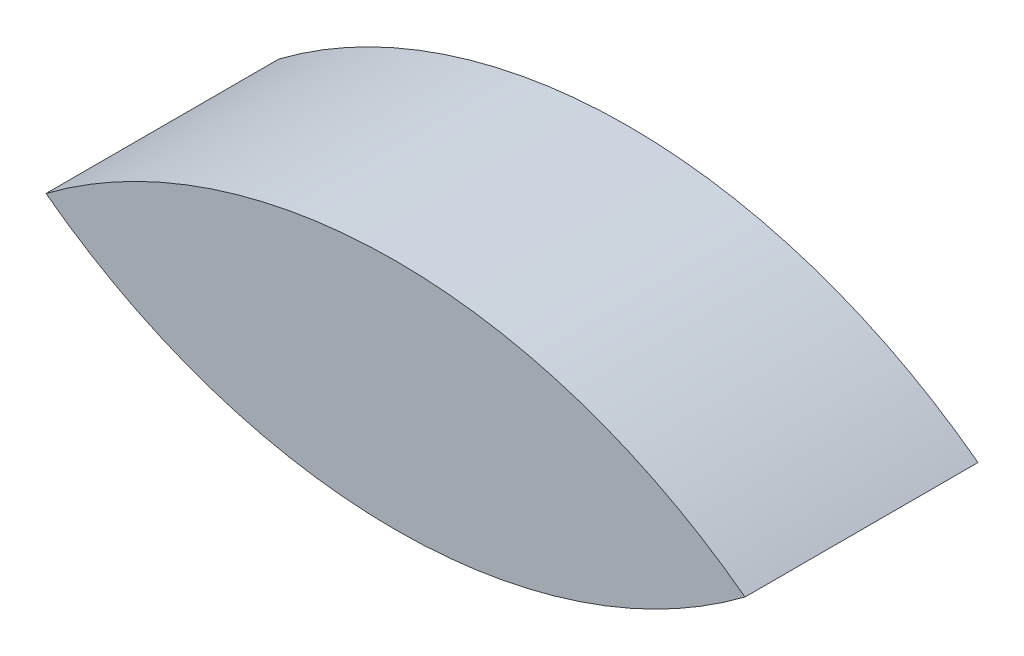
ISO-10303-21;
HEADER;
FILE_DESCRIPTION(('STEP AP214'),'2;1');
FILE_NAME('part.step','',(''),(''),'','','');
FILE_SCHEMA(('AUTOMOTIVE_DESIGN { 1 0 10303 214 1 1 1 1 }'));
ENDSEC;
DATA;
#1=APPLICATION_CONTEXT('core data for automotive mechanical design processes');
#2=APPLICATION_PROTOCOL_DEFINITION('international standard','automotive_design',2000,#1);
#3=PRODUCT_CONTEXT('',#1,'mechanical');
#4=PRODUCT('Part','Part','',(#3));
#5=PRODUCT_RELATED_PRODUCT_CATEGORY('part','',(#4));
#6=PRODUCT_DEFINITION_FORMATION('','',#4);
#7=PRODUCT_DEFINITION_CONTEXT('part definition',#1,'design');
#8=PRODUCT_DEFINITION('design','',#6,#7);
#9=PRODUCT_DEFINITION_SHAPE('','',#8);
#10=(LENGTH_UNIT() NAMED_UNIT(*) SI_UNIT(.MILLI.,.METRE.));
#11=(NAMED_UNIT(*) PLANE_ANGLE_UNIT() SI_UNIT($,.RADIAN.));
#12=(NAMED_UNIT(*) SI_UNIT($,.STERADIAN.) SOLID_ANGLE_UNIT());
#13=UNCERTAINTY_MEASURE_WITH_UNIT(LENGTH_MEASURE(1.E-05),#10,'distance_accuracy_value','');
#14=(GEOMETRIC_REPRESENTATION_CONTEXT(3) GLOBAL_UNCERTAINTY_ASSIGNED_CONTEXT((#13)) GLOBAL_UNIT_ASSIGNED_CONTEXT((#10,
#11,#12)) REPRESENTATION_CONTEXT('',''));
#15=CARTESIAN_POINT('',(0.,0.,0.));
#16=DIRECTION('',(0.,0.,1.));
#17=DIRECTION('',(1.,0.,0.));
#18=AXIS2_PLACEMENT_3D('',#15,#16,#17);
#19=CARTESIAN_POINT('',(0.,20.,5.));
#20=DIRECTION('',(0.,0.,-1.));
#21=DIRECTION('',(-1.,0.,0.));
#22=AXIS2_PLACEMENT_3D('',#19,#20,#21);
#23=CYLINDRICAL_SURFACE('',#22,25.);
#24=CARTESIAN_POINT('',(0.,20.,-5.));
#25=DIRECTION('',(0.,0.,1.));
#26=DIRECTION('',(1.,0.,0.));
#27=AXIS2_PLACEMENT_3D('',#24,#25,#26);
#28=CIRCLE('',#27,25.);
#29=CARTESIAN_POINT('',(-15.,0.,-5.));
#30=VERTEX_POINT('',#29);
#31=CARTESIAN_POINT('',(15.,0.,-5.));
#32=VERTEX_POINT('',#31);
#33=EDGE_CURVE('E76',#30,#32,#28,.T.);
#34=ORIENTED_EDGE('',*,*,#33,.T.);
#35=DIRECTION('',(0.,0.,-1.));
#36=VECTOR('',#35,1.);
#37=CARTESIAN_POINT('',(15.,0.,5.));
#38=LINE('',#37,#36);
#39=CARTESIAN_POINT('',(15.,0.,5.));
#40=VERTEX_POINT('',#39);
#41=EDGE_CURVE('E11',#40,#32,#38,.T.);
#42=ORIENTED_EDGE('',*,*,#41,.F.);
#43=CARTESIAN_POINT('',(0.,20.,5.));
#44=DIRECTION('',(0.,0.,1.));
#45=DIRECTION('',(1.,0.,0.));
#46=AXIS2_PLACEMENT_3D('',#43,#44,#45);
#47=CIRCLE('',#46,25.);
#48=CARTESIAN_POINT('',(-15.,0.,5.));
#49=VERTEX_POINT('',#48);
#50=EDGE_CURVE('E75',#49,#40,#47,.T.);
#51=ORIENTED_EDGE('',*,*,#50,.F.);
#52=DIRECTION('',(0.,0.,-1.));
#53=VECTOR('',#52,1.);
#54=CARTESIAN_POINT('',(-15.,0.,5.));
#55=LINE('',#54,#53);
#56=EDGE_CURVE('E52',#49,#30,#55,.T.);
#57=ORIENTED_EDGE('',*,*,#56,.T.);
#58=EDGE_LOOP('',(#34,#42,#51,#57));
#59=FACE_BOUND('',#58,.T.);
#60=ADVANCED_FACE('F43',(#59),#23,.T.);
#61=CARTESIAN_POINT('',(0.,-20.,5.));
#62=DIRECTION('',(0.,0.,-1.));
#63=DIRECTION('',(-1.,0.,0.));
#64=AXIS2_PLACEMENT_3D('',#61,#62,#63);
#65=CYLINDRICAL_SURFACE('',#64,25.);
#66=CARTESIAN_POINT('',(0.,-20.,-5.));
#67=DIRECTION('',(0.,0.,1.));
#68=DIRECTION('',(-1.,0.,0.));
#69=AXIS2_PLACEMENT_3D('',#66,#67,#68);
#70=CIRCLE('',#69,25.);
#71=EDGE_CURVE('E67',#32,#30,#70,.T.);
#72=ORIENTED_EDGE('',*,*,#71,.T.);
#73=ORIENTED_EDGE('',*,*,#56,.F.);
#74=CARTESIAN_POINT('',(0.,-20.,5.));
#75=DIRECTION('',(0.,0.,1.));
#76=DIRECTION('',(-1.,0.,0.));
#77=AXIS2_PLACEMENT_3D('',#74,#75,#76);
#78=CIRCLE('',#77,25.);
#79=EDGE_CURVE('E59',#40,#49,#78,.T.);
#80=ORIENTED_EDGE('',*,*,#79,.F.);
#81=ORIENTED_EDGE('',*,*,#41,.T.);
#82=EDGE_LOOP('',(#72,#73,#80,#81));
#83=FACE_BOUND('',#82,.T.);
#84=ADVANCED_FACE('F70',(#83),#65,.T.);
#85=CARTESIAN_POINT('',(0.,0.,5.));
#86=DIRECTION('',(0.,0.,1.));
#87=DIRECTION('',(1.,0.,0.));
#88=AXIS2_PLACEMENT_3D('',#85,#86,#87);
#89=PLANE('',#88);
#90=ORIENTED_EDGE('',*,*,#50,.T.);
#91=ORIENTED_EDGE('',*,*,#79,.T.);
#92=EDGE_LOOP('',(#90,#91));
#93=FACE_BOUND('',#92,.T.);
#94=ADVANCED_FACE('F87',(#93),#89,.T.);
#95=CARTESIAN_POINT('',(0.,0.,-5.));
#96=DIRECTION('',(0.,0.,1.));
#97=DIRECTION('',(1.,0.,0.));
#98=AXIS2_PLACEMENT_3D('',#95,#96,#97);
#99=PLANE('',#98);
#100=ORIENTED_EDGE('',*,*,#33,.F.);
#101=ORIENTED_EDGE('',*,*,#71,.F.);
#102=EDGE_LOOP('',(#100,#101));
#103=FACE_BOUND('',#102,.T.);
#104=ADVANCED_FACE('F80',(#103),#99,.F.);
#105=CLOSED_SHELL('',(#60,#84,#94,#104));
#106=MANIFOLD_SOLID_BREP('B2',#105);
#107=ADVANCED_BREP_SHAPE_REPRESENTATION('',(#18,#106),#14);
#108=SHAPE_DEFINITION_REPRESENTATION(#9,#107);
ENDSEC;
END-ISO-10303-21;
